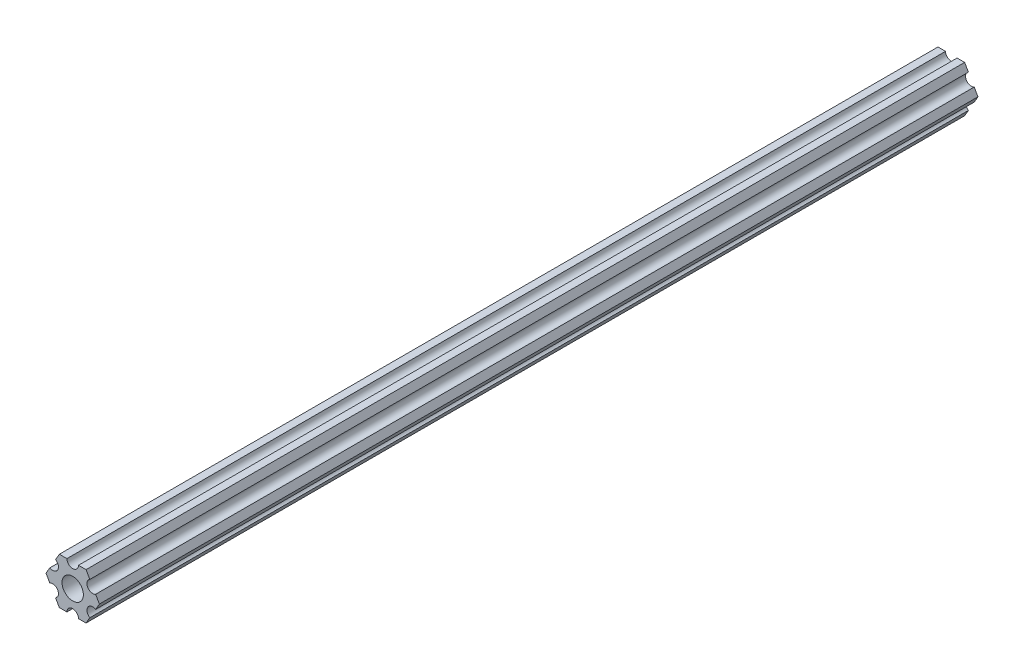
ISO-10303-21;
HEADER;
FILE_DESCRIPTION(('STEP AP214'),'2;1');
FILE_NAME('part.step','',(''),(''),'','','');
FILE_SCHEMA(('AUTOMOTIVE_DESIGN { 1 0 10303 214 1 1 1 1 }'));
ENDSEC;
DATA;
#1=APPLICATION_CONTEXT('core data for automotive mechanical design processes');
#2=APPLICATION_PROTOCOL_DEFINITION('international standard','automotive_design',2000,#1);
#3=PRODUCT_CONTEXT('',#1,'mechanical');
#4=PRODUCT('Part','Part','',(#3));
#5=PRODUCT_RELATED_PRODUCT_CATEGORY('part','',(#4));
#6=PRODUCT_DEFINITION_FORMATION('','',#4);
#7=PRODUCT_DEFINITION_CONTEXT('part definition',#1,'design');
#8=PRODUCT_DEFINITION('design','',#6,#7);
#9=PRODUCT_DEFINITION_SHAPE('','',#8);
#10=(LENGTH_UNIT() NAMED_UNIT(*) SI_UNIT(.MILLI.,.METRE.));
#11=(NAMED_UNIT(*) PLANE_ANGLE_UNIT() SI_UNIT($,.RADIAN.));
#12=(NAMED_UNIT(*) SI_UNIT($,.STERADIAN.) SOLID_ANGLE_UNIT());
#13=UNCERTAINTY_MEASURE_WITH_UNIT(LENGTH_MEASURE(1.E-05),#10,'distance_accuracy_value','');
#14=(GEOMETRIC_REPRESENTATION_CONTEXT(3) GLOBAL_UNCERTAINTY_ASSIGNED_CONTEXT((#13)) GLOBAL_UNIT_ASSIGNED_CONTEXT((#10,
#11,#12)) REPRESENTATION_CONTEXT('',''));
#15=CARTESIAN_POINT('',(0.,0.,0.));
#16=DIRECTION('',(0.,0.,1.));
#17=DIRECTION('',(1.,0.,0.));
#18=AXIS2_PLACEMENT_3D('',#15,#16,#17);
#19=CARTESIAN_POINT('',(-5.49926150638083,-3.17499966684068,-241.3));
#20=DIRECTION('',(0.,0.,1.));
#21=DIRECTION('',(1.,0.,0.));
#22=AXIS2_PLACEMENT_3D('',#19,#20,#21);
#23=CYLINDRICAL_SURFACE('',#22,1.58750000000001);
#24=CARTESIAN_POINT('',(-5.49926150638083,-3.17499966684068,0.));
#25=DIRECTION('',(0.,0.,-1.));
#26=DIRECTION('',(-1.,0.,0.));
#27=AXIS2_PLACEMENT_3D('',#24,#25,#26);
#28=CIRCLE('',#27,1.58750000000001);
#29=CARTESIAN_POINT('',(-6.29301142309098,-1.80018429024546,0.));
#30=VERTEX_POINT('',#29);
#31=CARTESIAN_POINT('',(-4.70551158967068,-4.54981504343589,0.));
#32=VERTEX_POINT('',#31);
#33=EDGE_CURVE('E190',#30,#32,#28,.T.);
#34=ORIENTED_EDGE('',*,*,#33,.F.);
#35=DIRECTION('',(0.,0.,1.));
#36=VECTOR('',#35,1.);
#37=CARTESIAN_POINT('',(-6.29301142309098,-1.80018429024546,-241.3));
#38=LINE('',#37,#36);
#39=CARTESIAN_POINT('',(-6.29301142309098,-1.80018429024546,-241.3));
#40=VERTEX_POINT('',#39);
#41=EDGE_CURVE('E11',#40,#30,#38,.T.);
#42=ORIENTED_EDGE('',*,*,#41,.F.);
#43=CARTESIAN_POINT('',(-5.49926150638083,-3.17499966684068,-241.3));
#44=DIRECTION('',(0.,0.,-1.));
#45=DIRECTION('',(-1.,0.,0.));
#46=AXIS2_PLACEMENT_3D('',#43,#44,#45);
#47=CIRCLE('',#46,1.58750000000001);
#48=CARTESIAN_POINT('',(-4.70551158967068,-4.54981504343589,-241.3));
#49=VERTEX_POINT('',#48);
#50=EDGE_CURVE('E241',#40,#49,#47,.T.);
#51=ORIENTED_EDGE('',*,*,#50,.T.);
#52=DIRECTION('',(0.,0.,1.));
#53=VECTOR('',#52,1.);
#54=CARTESIAN_POINT('',(-4.70551158967068,-4.54981504343589,-241.3));
#55=LINE('',#54,#53);
#56=EDGE_CURVE('E36',#49,#32,#55,.T.);
#57=ORIENTED_EDGE('',*,*,#56,.T.);
#58=EDGE_LOOP('',(#34,#42,#51,#57));
#59=FACE_BOUND('',#58,.T.);
#60=ADVANCED_FACE('F33',(#59),#23,.F.);
#61=CARTESIAN_POINT('',(-7.33234841870826,4.44212518856872E-07,-241.3));
#62=DIRECTION('',(-0.866025434075723,-0.499999947533953,0.));
#63=DIRECTION('',(0.499999947533953,-0.866025434075723,0.));
#64=AXIS2_PLACEMENT_3D('',#61,#62,#63);
#65=PLANE('',#64);
#66=DIRECTION('',(0.499999947533953,-0.866025434075723,0.));
#67=VECTOR('',#66,1.);
#68=CARTESIAN_POINT('',(-7.33234841870826,4.44212518856872E-07,0.));
#69=LINE('',#68,#67);
#70=CARTESIAN_POINT('',(-7.33234841870826,4.44212518856872E-07,0.));
#71=VERTEX_POINT('',#70);
#72=EDGE_CURVE('E239',#71,#30,#69,.T.);
#73=ORIENTED_EDGE('',*,*,#72,.F.);
#74=DIRECTION('',(0.,0.,1.));
#75=VECTOR('',#74,1.);
#76=CARTESIAN_POINT('',(-7.33234841870826,4.44212518856872E-07,-241.3));
#77=LINE('',#76,#75);
#78=CARTESIAN_POINT('',(-7.33234841870826,4.44212518856872E-07,-241.3));
#79=VERTEX_POINT('',#78);
#80=EDGE_CURVE('E42',#79,#71,#77,.T.);
#81=ORIENTED_EDGE('',*,*,#80,.F.);
#82=DIRECTION('',(0.499999947533953,-0.866025434075723,0.));
#83=VECTOR('',#82,1.);
#84=CARTESIAN_POINT('',(-7.33234841870826,4.44212518856872E-07,-241.3));
#85=LINE('',#84,#83);
#86=EDGE_CURVE('E180',#79,#40,#85,.T.);
#87=ORIENTED_EDGE('',*,*,#86,.T.);
#88=ORIENTED_EDGE('',*,*,#41,.T.);
#89=EDGE_LOOP('',(#73,#81,#87,#88));
#90=FACE_BOUND('',#89,.T.);
#91=ADVANCED_FACE('F273',(#90),#65,.T.);
#92=CARTESIAN_POINT('',(-6.29301120497139,1.80018505273895,-241.3));
#93=DIRECTION('',(-0.866025373493145,0.500000052466056,0.));
#94=DIRECTION('',(-0.500000052466056,-0.866025373493145,0.));
#95=AXIS2_PLACEMENT_3D('',#92,#93,#94);
#96=PLANE('',#95);
#97=DIRECTION('',(-0.500000052466056,-0.866025373493145,0.));
#98=VECTOR('',#97,1.);
#99=CARTESIAN_POINT('',(-6.29301120497139,1.80018505273895,0.));
#100=LINE('',#99,#98);
#101=CARTESIAN_POINT('',(-6.29301120497139,1.80018505273895,0.));
#102=VERTEX_POINT('',#101);
#103=EDGE_CURVE('E167',#102,#71,#100,.T.);
#104=ORIENTED_EDGE('',*,*,#103,.F.);
#105=DIRECTION('',(0.,0.,1.));
#106=VECTOR('',#105,1.);
#107=CARTESIAN_POINT('',(-6.29301120497139,1.80018505273895,-241.3));
#108=LINE('',#107,#106);
#109=CARTESIAN_POINT('',(-6.29301120497139,1.80018505273895,-241.3));
#110=VERTEX_POINT('',#109);
#111=EDGE_CURVE('E162',#110,#102,#108,.T.);
#112=ORIENTED_EDGE('',*,*,#111,.F.);
#113=DIRECTION('',(-0.500000052466056,-0.866025373493145,0.));
#114=VECTOR('',#113,1.);
#115=CARTESIAN_POINT('',(-6.29301120497139,1.80018505273895,-241.3));
#116=LINE('',#115,#114);
#117=EDGE_CURVE('E165',#110,#79,#116,.T.);
#118=ORIENTED_EDGE('',*,*,#117,.T.);
#119=ORIENTED_EDGE('',*,*,#80,.T.);
#120=EDGE_LOOP('',(#104,#112,#118,#119));
#121=FACE_BOUND('',#120,.T.);
#122=ADVANCED_FACE('F164',(#121),#96,.T.);
#123=CARTESIAN_POINT('',(-5.49926112168152,3.17500033315931,-241.3));
#124=DIRECTION('',(0.,0.,1.));
#125=DIRECTION('',(1.,0.,0.));
#126=AXIS2_PLACEMENT_3D('',#123,#124,#125);
#127=CYLINDRICAL_SURFACE('',#126,1.5875);
#128=CARTESIAN_POINT('',(-5.49926112168152,3.17500033315931,0.));
#129=DIRECTION('',(0.,0.,-1.));
#130=DIRECTION('',(-1.,0.,0.));
#131=AXIS2_PLACEMENT_3D('',#128,#129,#130);
#132=CIRCLE('',#131,1.5875);
#133=CARTESIAN_POINT('',(-4.70551103839166,4.54981561357968,0.));
#134=VERTEX_POINT('',#133);
#135=EDGE_CURVE('E236',#134,#102,#132,.T.);
#136=ORIENTED_EDGE('',*,*,#135,.F.);
#137=DIRECTION('',(0.,0.,1.));
#138=VECTOR('',#137,1.);
#139=CARTESIAN_POINT('',(-4.70551103839166,4.54981561357968,-241.3));
#140=LINE('',#139,#138);
#141=CARTESIAN_POINT('',(-4.70551103839166,4.54981561357968,-241.3));
#142=VERTEX_POINT('',#141);
#143=EDGE_CURVE('E172',#142,#134,#140,.T.);
#144=ORIENTED_EDGE('',*,*,#143,.F.);
#145=CARTESIAN_POINT('',(-5.49926112168152,3.17500033315931,-241.3));
#146=DIRECTION('',(0.,0.,-1.));
#147=DIRECTION('',(-1.,0.,0.));
#148=AXIS2_PLACEMENT_3D('',#145,#146,#147);
#149=CIRCLE('',#148,1.5875);
#150=EDGE_CURVE('E178',#142,#110,#149,.T.);
#151=ORIENTED_EDGE('',*,*,#150,.T.);
#152=ORIENTED_EDGE('',*,*,#111,.T.);
#153=EDGE_LOOP('',(#136,#144,#151,#152));
#154=FACE_BOUND('',#153,.T.);
#155=ADVANCED_FACE('F182',(#154),#127,.F.);
#156=CARTESIAN_POINT('',(-3.66617382465472,6.35000022210622,-241.3));
#157=DIRECTION('',(-0.866025373493145,0.500000052466056,0.));
#158=DIRECTION('',(-0.500000052466056,-0.866025373493145,0.));
#159=AXIS2_PLACEMENT_3D('',#156,#157,#158);
#160=PLANE('',#159);
#161=DIRECTION('',(-0.500000052466056,-0.866025373493145,0.));
#162=VECTOR('',#161,1.);
#163=CARTESIAN_POINT('',(-3.66617382465472,6.35000022210622,0.));
#164=LINE('',#163,#162);
#165=CARTESIAN_POINT('',(-3.66617382465472,6.35000022210622,0.));
#166=VERTEX_POINT('',#165);
#167=EDGE_CURVE('E233',#166,#134,#164,.T.);
#168=ORIENTED_EDGE('',*,*,#167,.F.);
#169=DIRECTION('',(0.,0.,1.));
#170=VECTOR('',#169,1.);
#171=CARTESIAN_POINT('',(-3.66617382465472,6.35000022210622,-241.3));
#172=LINE('',#171,#170);
#173=CARTESIAN_POINT('',(-3.66617382465472,6.35000022210622,-241.3));
#174=VERTEX_POINT('',#173);
#175=EDGE_CURVE('E245',#174,#166,#172,.T.);
#176=ORIENTED_EDGE('',*,*,#175,.F.);
#177=DIRECTION('',(-0.500000052466056,-0.866025373493145,0.));
#178=VECTOR('',#177,1.);
#179=CARTESIAN_POINT('',(-3.66617382465472,6.35000022210622,-241.3));
#180=LINE('',#179,#178);
#181=EDGE_CURVE('E183',#174,#142,#180,.T.);
#182=ORIENTED_EDGE('',*,*,#181,.T.);
#183=ORIENTED_EDGE('',*,*,#143,.T.);
#184=EDGE_LOOP('',(#168,#176,#182,#183));
#185=FACE_BOUND('',#184,.T.);
#186=ADVANCED_FACE('F286',(#185),#160,.T.);
#187=CARTESIAN_POINT('',(-1.58749884590197,6.35000022210623,-241.3));
#188=DIRECTION('',(0.,1.,0.));
#189=DIRECTION('',(-1.,0.,0.));
#190=AXIS2_PLACEMENT_3D('',#187,#188,#189);
#191=PLANE('',#190);
#192=DIRECTION('',(-1.,0.,0.));
#193=VECTOR('',#192,1.);
#194=CARTESIAN_POINT('',(-1.58749884590197,6.35000022210623,0.));
#195=LINE('',#194,#193);
#196=CARTESIAN_POINT('',(-1.58749884590197,6.35000022210623,0.));
#197=VERTEX_POINT('',#196);
#198=EDGE_CURVE('E230',#197,#166,#195,.T.);
#199=ORIENTED_EDGE('',*,*,#198,.F.);
#200=DIRECTION('',(0.,0.,1.));
#201=VECTOR('',#200,1.);
#202=CARTESIAN_POINT('',(-1.58749884590197,6.35000022210623,-241.3));
#203=LINE('',#202,#201);
#204=CARTESIAN_POINT('',(-1.58749884590197,6.35000022210623,-241.3));
#205=VERTEX_POINT('',#204);
#206=EDGE_CURVE('E247',#205,#197,#203,.T.);
#207=ORIENTED_EDGE('',*,*,#206,.F.);
#208=DIRECTION('',(-1.,0.,0.));
#209=VECTOR('',#208,1.);
#210=CARTESIAN_POINT('',(-1.58749884590197,6.35000022210623,-241.3));
#211=LINE('',#210,#209);
#212=EDGE_CURVE('E185',#205,#174,#211,.T.);
#213=ORIENTED_EDGE('',*,*,#212,.T.);
#214=ORIENTED_EDGE('',*,*,#175,.T.);
#215=EDGE_LOOP('',(#199,#207,#213,#214));
#216=FACE_BOUND('',#215,.T.);
#217=ADVANCED_FACE('F289',(#216),#191,.T.);
#218=CARTESIAN_POINT('',(3.84699344941095E-07,6.35000022210623,-241.3));
#219=DIRECTION('',(0.,0.,1.));
#220=DIRECTION('',(1.,0.,0.));
#221=AXIS2_PLACEMENT_3D('',#218,#219,#220);
#222=CYLINDRICAL_SURFACE('',#221,1.58749884590197);
#223=CARTESIAN_POINT('',(3.84699344941095E-07,6.35000022210623,0.));
#224=DIRECTION('',(0.,0.,-1.));
#225=DIRECTION('',(-1.,0.,0.));
#226=AXIS2_PLACEMENT_3D('',#223,#224,#225);
#227=CIRCLE('',#226,1.58749884590197);
#228=CARTESIAN_POINT('',(1.58749923060131,6.35000022210623,0.));
#229=VERTEX_POINT('',#228);
#230=EDGE_CURVE('E227',#229,#197,#227,.T.);
#231=ORIENTED_EDGE('',*,*,#230,.F.);
#232=DIRECTION('',(0.,0.,1.));
#233=VECTOR('',#232,1.);
#234=CARTESIAN_POINT('',(1.58749923060131,6.35000022210623,-241.3));
#235=LINE('',#234,#233);
#236=CARTESIAN_POINT('',(1.58749923060131,6.35000022210623,-241.3));
#237=VERTEX_POINT('',#236);
#238=EDGE_CURVE('E249',#237,#229,#235,.T.);
#239=ORIENTED_EDGE('',*,*,#238,.F.);
#240=CARTESIAN_POINT('',(3.84699344941095E-07,6.35000022210623,-241.3));
#241=DIRECTION('',(0.,0.,-1.));
#242=DIRECTION('',(-1.,0.,0.));
#243=AXIS2_PLACEMENT_3D('',#240,#241,#242);
#244=CIRCLE('',#243,1.58749884590197);
#245=EDGE_CURVE('E394',#237,#205,#244,.T.);
#246=ORIENTED_EDGE('',*,*,#245,.T.);
#247=ORIENTED_EDGE('',*,*,#206,.T.);
#248=EDGE_LOOP('',(#231,#239,#246,#247));
#249=FACE_BOUND('',#248,.T.);
#250=ADVANCED_FACE('F293',(#249),#222,.F.);
#251=CARTESIAN_POINT('',(3.66617452134701,6.35000022210623,-241.3));
#252=DIRECTION('',(0.,1.,0.));
#253=DIRECTION('',(-1.,0.,0.));
#254=AXIS2_PLACEMENT_3D('',#251,#252,#253);
#255=PLANE('',#254);
#256=DIRECTION('',(-1.,0.,0.));
#257=VECTOR('',#256,1.);
#258=CARTESIAN_POINT('',(3.66617452134701,6.35000022210623,0.));
#259=LINE('',#258,#257);
#260=CARTESIAN_POINT('',(3.66617452134701,6.35000022210623,0.));
#261=VERTEX_POINT('',#260);
#262=EDGE_CURVE('E224',#261,#229,#259,.T.);
#263=ORIENTED_EDGE('',*,*,#262,.F.);
#264=DIRECTION('',(0.,0.,1.));
#265=VECTOR('',#264,1.);
#266=CARTESIAN_POINT('',(3.66617452134701,6.35000022210623,-241.3));
#267=LINE('',#266,#265);
#268=CARTESIAN_POINT('',(3.66617452134701,6.35000022210623,-241.3));
#269=VERTEX_POINT('',#268);
#270=EDGE_CURVE('E251',#269,#261,#267,.T.);
#271=ORIENTED_EDGE('',*,*,#270,.F.);
#272=DIRECTION('',(-1.,0.,0.));
#273=VECTOR('',#272,1.);
#274=CARTESIAN_POINT('',(3.66617452134701,6.35000022210623,-241.3));
#275=LINE('',#274,#273);
#276=EDGE_CURVE('E391',#269,#237,#275,.T.);
#277=ORIENTED_EDGE('',*,*,#276,.T.);
#278=ORIENTED_EDGE('',*,*,#238,.T.);
#279=EDGE_LOOP('',(#263,#271,#277,#278));
#280=FACE_BOUND('',#279,.T.);
#281=ADVANCED_FACE('F297',(#280),#255,.T.);
#282=CARTESIAN_POINT('',(4.70551142760333,4.54981551649452,-241.3));
#283=DIRECTION('',(0.866025449221368,0.499999921300922,0.));
#284=DIRECTION('',(-0.499999921300922,0.866025449221368,0.));
#285=AXIS2_PLACEMENT_3D('',#282,#283,#284);
#286=PLANE('',#285);
#287=DIRECTION('',(-0.499999921300922,0.866025449221368,0.));
#288=VECTOR('',#287,1.);
#289=CARTESIAN_POINT('',(4.70551142760333,4.54981551649452,0.));
#290=LINE('',#289,#288);
#291=CARTESIAN_POINT('',(4.70551142760333,4.54981551649452,0.));
#292=VERTEX_POINT('',#291);
#293=EDGE_CURVE('E221',#292,#261,#290,.T.);
#294=ORIENTED_EDGE('',*,*,#293,.F.);
#295=DIRECTION('',(0.,0.,1.));
#296=VECTOR('',#295,1.);
#297=CARTESIAN_POINT('',(4.70551142760333,4.54981551649452,-241.3));
#298=LINE('',#297,#296);
#299=CARTESIAN_POINT('',(4.70551142760333,4.54981551649452,-241.3));
#300=VERTEX_POINT('',#299);
#301=EDGE_CURVE('E253',#300,#292,#298,.T.);
#302=ORIENTED_EDGE('',*,*,#301,.F.);
#303=DIRECTION('',(-0.499999921300922,0.866025449221368,0.));
#304=VECTOR('',#303,1.);
#305=CARTESIAN_POINT('',(4.70551142760333,4.54981551649452,-241.3));
#306=LINE('',#305,#304);
#307=EDGE_CURVE('E388',#300,#269,#306,.T.);
#308=ORIENTED_EDGE('',*,*,#307,.T.);
#309=ORIENTED_EDGE('',*,*,#270,.T.);
#310=EDGE_LOOP('',(#294,#302,#308,#309));
#311=FACE_BOUND('',#310,.T.);
#312=ADVANCED_FACE('F301',(#311),#286,.T.);
#313=CARTESIAN_POINT('',(5.49926130266854,3.1750001158556,-241.3));
#314=DIRECTION('',(0.,0.,1.));
#315=DIRECTION('',(1.,0.,0.));
#316=AXIS2_PLACEMENT_3D('',#313,#314,#315);
#317=CYLINDRICAL_SURFACE('',#316,1.5875);
#318=CARTESIAN_POINT('',(5.49926130266854,3.1750001158556,0.));
#319=DIRECTION('',(0.,0.,-1.));
#320=DIRECTION('',(-1.,0.,0.));
#321=AXIS2_PLACEMENT_3D('',#318,#319,#320);
#322=CIRCLE('',#321,1.5875);
#323=CARTESIAN_POINT('',(6.29301117773375,1.80018471521667,0.));
#324=VERTEX_POINT('',#323);
#325=EDGE_CURVE('E218',#324,#292,#322,.T.);
#326=ORIENTED_EDGE('',*,*,#325,.F.);
#327=DIRECTION('',(0.,0.,1.));
#328=VECTOR('',#327,1.);
#329=CARTESIAN_POINT('',(6.29301117773375,1.80018471521667,-241.3));
#330=LINE('',#329,#328);
#331=CARTESIAN_POINT('',(6.29301117773375,1.80018471521667,-241.3));
#332=VERTEX_POINT('',#331);
#333=EDGE_CURVE('E255',#332,#324,#330,.T.);
#334=ORIENTED_EDGE('',*,*,#333,.F.);
#335=CARTESIAN_POINT('',(5.49926130266854,3.1750001158556,-241.3));
#336=DIRECTION('',(0.,0.,-1.));
#337=DIRECTION('',(-1.,0.,0.));
#338=AXIS2_PLACEMENT_3D('',#335,#336,#337);
#339=CIRCLE('',#338,1.5875);
#340=EDGE_CURVE('E385',#332,#300,#339,.T.);
#341=ORIENTED_EDGE('',*,*,#340,.T.);
#342=ORIENTED_EDGE('',*,*,#301,.T.);
#343=EDGE_LOOP('',(#326,#334,#341,#342));
#344=FACE_BOUND('',#343,.T.);
#345=ADVANCED_FACE('F305',(#344),#317,.F.);
#346=CARTESIAN_POINT('',(7.33234803400895,9.61748368946088E-08,-241.3));
#347=DIRECTION('',(0.866025449221368,0.499999921300922,0.));
#348=DIRECTION('',(-0.499999921300922,0.866025449221368,0.));
#349=AXIS2_PLACEMENT_3D('',#346,#347,#348);
#350=PLANE('',#349);
#351=DIRECTION('',(-0.499999921300922,0.866025449221368,0.));
#352=VECTOR('',#351,1.);
#353=CARTESIAN_POINT('',(7.33234803400895,9.61748368946088E-08,0.));
#354=LINE('',#353,#352);
#355=CARTESIAN_POINT('',(7.33234803400895,9.61748368946088E-08,0.));
#356=VERTEX_POINT('',#355);
#357=EDGE_CURVE('E215',#356,#324,#354,.T.);
#358=ORIENTED_EDGE('',*,*,#357,.F.);
#359=DIRECTION('',(0.,0.,1.));
#360=VECTOR('',#359,1.);
#361=CARTESIAN_POINT('',(7.33234803400895,9.61748368946088E-08,-241.3));
#362=LINE('',#361,#360);
#363=CARTESIAN_POINT('',(7.33234803400895,9.61748368946088E-08,-241.3));
#364=VERTEX_POINT('',#363);
#365=EDGE_CURVE('E257',#364,#356,#362,.T.);
#366=ORIENTED_EDGE('',*,*,#365,.F.);
#367=DIRECTION('',(-0.499999921300922,0.866025449221368,0.));
#368=VECTOR('',#367,1.);
#369=CARTESIAN_POINT('',(7.33234803400895,9.61748368946088E-08,-241.3));
#370=LINE('',#369,#368);
#371=EDGE_CURVE('E382',#364,#332,#370,.T.);
#372=ORIENTED_EDGE('',*,*,#371,.T.);
#373=ORIENTED_EDGE('',*,*,#333,.T.);
#374=EDGE_LOOP('',(#358,#366,#372,#373));
#375=FACE_BOUND('',#374,.T.);
#376=ADVANCED_FACE('F309',(#375),#350,.T.);
#377=CARTESIAN_POINT('',(6.29301092933191,-1.80018457531732,-241.3));
#378=DIRECTION('',(0.866025403784438,-0.5,0.));
#379=DIRECTION('',(0.5,0.866025403784438,0.));
#380=AXIS2_PLACEMENT_3D('',#377,#378,#379);
#381=PLANE('',#380);
#382=DIRECTION('',(0.5,0.866025403784438,0.));
#383=VECTOR('',#382,1.);
#384=CARTESIAN_POINT('',(6.29301092933191,-1.80018457531732,0.));
#385=LINE('',#384,#383);
#386=CARTESIAN_POINT('',(6.29301092933191,-1.80018457531732,0.));
#387=VERTEX_POINT('',#386);
#388=EDGE_CURVE('E212',#387,#356,#385,.T.);
#389=ORIENTED_EDGE('',*,*,#388,.F.);
#390=DIRECTION('',(0.,0.,1.));
#391=VECTOR('',#390,1.);
#392=CARTESIAN_POINT('',(6.29301092933191,-1.80018457531732,-241.3));
#393=LINE('',#392,#391);
#394=CARTESIAN_POINT('',(6.29301092933191,-1.80018457531732,-241.3));
#395=VERTEX_POINT('',#394);
#396=EDGE_CURVE('E259',#395,#387,#393,.T.);
#397=ORIENTED_EDGE('',*,*,#396,.F.);
#398=DIRECTION('',(0.5,0.866025403784438,0.));
#399=VECTOR('',#398,1.);
#400=CARTESIAN_POINT('',(6.29301092933191,-1.80018457531732,-241.3));
#401=LINE('',#400,#399);
#402=EDGE_CURVE('E379',#395,#364,#401,.T.);
#403=ORIENTED_EDGE('',*,*,#402,.T.);
#404=ORIENTED_EDGE('',*,*,#365,.T.);
#405=EDGE_LOOP('',(#389,#397,#403,#404));
#406=FACE_BOUND('',#405,.T.);
#407=ADVANCED_FACE('F313',(#406),#381,.T.);
#408=CARTESIAN_POINT('',(5.49926092933191,-3.17499990382512,-241.3));
#409=DIRECTION('',(0.,0.,1.));
#410=DIRECTION('',(1.,0.,0.));
#411=AXIS2_PLACEMENT_3D('',#408,#409,#410);
#412=CYLINDRICAL_SURFACE('',#411,1.5875);
#413=CARTESIAN_POINT('',(5.49926092933191,-3.17499990382512,0.));
#414=DIRECTION('',(0.,0.,-1.));
#415=DIRECTION('',(-1.,0.,0.));
#416=AXIS2_PLACEMENT_3D('',#413,#414,#415);
#417=CIRCLE('',#416,1.5875);
#418=CARTESIAN_POINT('',(4.70551092933191,-4.54981523233291,0.));
#419=VERTEX_POINT('',#418);
#420=EDGE_CURVE('E209',#419,#387,#417,.T.);
#421=ORIENTED_EDGE('',*,*,#420,.F.);
#422=DIRECTION('',(0.,0.,1.));
#423=VECTOR('',#422,1.);
#424=CARTESIAN_POINT('',(4.70551092933191,-4.54981523233291,-241.3));
#425=LINE('',#424,#423);
#426=CARTESIAN_POINT('',(4.70551092933191,-4.54981523233291,-241.3));
#427=VERTEX_POINT('',#426);
#428=EDGE_CURVE('E261',#427,#419,#425,.T.);
#429=ORIENTED_EDGE('',*,*,#428,.F.);
#430=CARTESIAN_POINT('',(5.49926092933191,-3.17499990382512,-241.3));
#431=DIRECTION('',(0.,0.,-1.));
#432=DIRECTION('',(-1.,0.,0.));
#433=AXIS2_PLACEMENT_3D('',#430,#431,#432);
#434=CIRCLE('',#433,1.5875);
#435=EDGE_CURVE('E376',#427,#395,#434,.T.);
#436=ORIENTED_EDGE('',*,*,#435,.T.);
#437=ORIENTED_EDGE('',*,*,#396,.T.);
#438=EDGE_LOOP('',(#421,#429,#436,#437));
#439=FACE_BOUND('',#438,.T.);
#440=ADVANCED_FACE('F317',(#439),#412,.F.);
#441=CARTESIAN_POINT('',(3.66617382465481,-6.34999990382519,-241.3));
#442=DIRECTION('',(0.866025403784439,-0.5,0.));
#443=DIRECTION('',(0.5,0.866025403784439,0.));
#444=AXIS2_PLACEMENT_3D('',#441,#442,#443);
#445=PLANE('',#444);
#446=DIRECTION('',(0.5,0.866025403784439,0.));
#447=VECTOR('',#446,1.);
#448=CARTESIAN_POINT('',(3.66617382465481,-6.34999990382519,0.));
#449=LINE('',#448,#447);
#450=CARTESIAN_POINT('',(3.66617382465481,-6.34999990382519,0.));
#451=VERTEX_POINT('',#450);
#452=EDGE_CURVE('E206',#451,#419,#449,.T.);
#453=ORIENTED_EDGE('',*,*,#452,.F.);
#454=DIRECTION('',(0.,0.,1.));
#455=VECTOR('',#454,1.);
#456=CARTESIAN_POINT('',(3.66617382465481,-6.34999990382519,-241.3));
#457=LINE('',#456,#455);
#458=CARTESIAN_POINT('',(3.66617382465481,-6.34999990382519,-241.3));
#459=VERTEX_POINT('',#458);
#460=EDGE_CURVE('E263',#459,#451,#457,.T.);
#461=ORIENTED_EDGE('',*,*,#460,.F.);
#462=DIRECTION('',(0.5,0.866025403784439,0.));
#463=VECTOR('',#462,1.);
#464=CARTESIAN_POINT('',(3.66617382465481,-6.34999990382519,-241.3));
#465=LINE('',#464,#463);
#466=EDGE_CURVE('E373',#459,#427,#465,.T.);
#467=ORIENTED_EDGE('',*,*,#466,.T.);
#468=ORIENTED_EDGE('',*,*,#428,.T.);
#469=EDGE_LOOP('',(#453,#461,#467,#468));
#470=FACE_BOUND('',#469,.T.);
#471=ADVANCED_FACE('F321',(#470),#445,.T.);
#472=CARTESIAN_POINT('',(1.58750115409778,-6.34999990382519,-241.3));
#473=DIRECTION('',(0.,-1.,0.));
#474=DIRECTION('',(1.,0.,0.));
#475=AXIS2_PLACEMENT_3D('',#472,#473,#474);
#476=PLANE('',#475);
#477=DIRECTION('',(1.,0.,0.));
#478=VECTOR('',#477,1.);
#479=CARTESIAN_POINT('',(1.58750115409778,-6.34999990382519,0.));
#480=LINE('',#479,#478);
#481=CARTESIAN_POINT('',(1.58750115409778,-6.34999990382519,0.));
#482=VERTEX_POINT('',#481);
#483=EDGE_CURVE('E203',#482,#451,#480,.T.);
#484=ORIENTED_EDGE('',*,*,#483,.F.);
#485=DIRECTION('',(0.,0.,1.));
#486=VECTOR('',#485,1.);
#487=CARTESIAN_POINT('',(1.58750115409778,-6.34999990382519,-241.3));
#488=LINE('',#487,#486);
#489=CARTESIAN_POINT('',(1.58750115409778,-6.34999990382519,-241.3));
#490=VERTEX_POINT('',#489);
#491=EDGE_CURVE('E265',#490,#482,#488,.T.);
#492=ORIENTED_EDGE('',*,*,#491,.F.);
#493=DIRECTION('',(1.,0.,0.));
#494=VECTOR('',#493,1.);
#495=CARTESIAN_POINT('',(1.58750115409778,-6.34999990382519,-241.3));
#496=LINE('',#495,#494);
#497=EDGE_CURVE('E370',#490,#459,#496,.T.);
#498=ORIENTED_EDGE('',*,*,#497,.T.);
#499=ORIENTED_EDGE('',*,*,#460,.T.);
#500=EDGE_LOOP('',(#484,#492,#498,#499));
#501=FACE_BOUND('',#500,.T.);
#502=ADVANCED_FACE('F325',(#501),#476,.T.);
#503=CARTESIAN_POINT('',(-3.8469926204343E-07,-6.34999990382519,-241.3));
#504=DIRECTION('',(0.,0.,1.));
#505=DIRECTION('',(1.,0.,0.));
#506=AXIS2_PLACEMENT_3D('',#503,#504,#505);
#507=CYLINDRICAL_SURFACE('',#506,1.58750115409778);
#508=CARTESIAN_POINT('',(-3.8469926204343E-07,-6.34999990382519,0.));
#509=DIRECTION('',(0.,0.,-1.));
#510=DIRECTION('',(-1.,0.,0.));
#511=AXIS2_PLACEMENT_3D('',#508,#509,#510);
#512=CIRCLE('',#511,1.58750115409778);
#513=CARTESIAN_POINT('',(-1.58750153879705,-6.34999990382519,0.));
#514=VERTEX_POINT('',#513);
#515=EDGE_CURVE('E200',#514,#482,#512,.T.);
#516=ORIENTED_EDGE('',*,*,#515,.F.);
#517=DIRECTION('',(0.,0.,1.));
#518=VECTOR('',#517,1.);
#519=CARTESIAN_POINT('',(-1.58750153879705,-6.34999990382519,-241.3));
#520=LINE('',#519,#518);
#521=CARTESIAN_POINT('',(-1.58750153879705,-6.34999990382519,-241.3));
#522=VERTEX_POINT('',#521);
#523=EDGE_CURVE('E267',#522,#514,#520,.T.);
#524=ORIENTED_EDGE('',*,*,#523,.F.);
#525=CARTESIAN_POINT('',(-3.8469926204343E-07,-6.34999990382519,-241.3));
#526=DIRECTION('',(0.,0.,-1.));
#527=DIRECTION('',(-1.,0.,0.));
#528=AXIS2_PLACEMENT_3D('',#525,#526,#527);
#529=CIRCLE('',#528,1.58750115409778);
#530=EDGE_CURVE('E367',#522,#490,#529,.T.);
#531=ORIENTED_EDGE('',*,*,#530,.T.);
#532=ORIENTED_EDGE('',*,*,#491,.T.);
#533=EDGE_LOOP('',(#516,#524,#531,#532));
#534=FACE_BOUND('',#533,.T.);
#535=ADVANCED_FACE('F329',(#534),#507,.F.);
#536=CARTESIAN_POINT('',(-3.66617452134693,-6.34999990382519,-241.3));
#537=DIRECTION('',(0.,-1.,0.));
#538=DIRECTION('',(1.,0.,0.));
#539=AXIS2_PLACEMENT_3D('',#536,#537,#538);
#540=PLANE('',#539);
#541=DIRECTION('',(1.,0.,0.));
#542=VECTOR('',#541,1.);
#543=CARTESIAN_POINT('',(-3.66617452134693,-6.34999990382519,0.));
#544=LINE('',#543,#542);
#545=CARTESIAN_POINT('',(-3.66617452134693,-6.34999990382519,0.));
#546=VERTEX_POINT('',#545);
#547=EDGE_CURVE('E197',#546,#514,#544,.T.);
#548=ORIENTED_EDGE('',*,*,#547,.F.);
#549=DIRECTION('',(0.,0.,1.));
#550=VECTOR('',#549,1.);
#551=CARTESIAN_POINT('',(-3.66617452134693,-6.34999990382519,-241.3));
#552=LINE('',#551,#550);
#553=CARTESIAN_POINT('',(-3.66617452134693,-6.34999990382519,-241.3));
#554=VERTEX_POINT('',#553);
#555=EDGE_CURVE('E268',#554,#546,#552,.T.);
#556=ORIENTED_EDGE('',*,*,#555,.F.);
#557=DIRECTION('',(1.,0.,0.));
#558=VECTOR('',#557,1.);
#559=CARTESIAN_POINT('',(-3.66617452134693,-6.34999990382519,-241.3));
#560=LINE('',#559,#558);
#561=EDGE_CURVE('E364',#554,#522,#560,.T.);
#562=ORIENTED_EDGE('',*,*,#561,.T.);
#563=ORIENTED_EDGE('',*,*,#523,.T.);
#564=EDGE_LOOP('',(#548,#556,#562,#563));
#565=FACE_BOUND('',#564,.T.);
#566=ADVANCED_FACE('F333',(#565),#540,.T.);
#567=CARTESIAN_POINT('',(-4.70551158967068,-4.54981504343589,-241.3));
#568=DIRECTION('',(-0.866025434075723,-0.499999947533953,0.));
#569=DIRECTION('',(0.499999947533953,-0.866025434075723,0.));
#570=AXIS2_PLACEMENT_3D('',#567,#568,#569);
#571=PLANE('',#570);
#572=DIRECTION('',(0.499999947533953,-0.866025434075723,0.));
#573=VECTOR('',#572,1.);
#574=CARTESIAN_POINT('',(-4.70551158967068,-4.54981504343589,0.));
#575=LINE('',#574,#573);
#576=EDGE_CURVE('E193',#32,#546,#575,.T.);
#577=ORIENTED_EDGE('',*,*,#576,.F.);
#578=ORIENTED_EDGE('',*,*,#56,.F.);
#579=DIRECTION('',(0.499999947533953,-0.866025434075723,0.));
#580=VECTOR('',#579,1.);
#581=CARTESIAN_POINT('',(-4.70551158967068,-4.54981504343589,-241.3));
#582=LINE('',#581,#580);
#583=EDGE_CURVE('E362',#49,#554,#582,.T.);
#584=ORIENTED_EDGE('',*,*,#583,.T.);
#585=ORIENTED_EDGE('',*,*,#555,.T.);
#586=EDGE_LOOP('',(#577,#578,#584,#585));
#587=FACE_BOUND('',#586,.T.);
#588=ADVANCED_FACE('F270',(#587),#571,.T.);
#589=CARTESIAN_POINT('',(-5.49926150638083,-3.17499966684068,-241.3));
#590=DIRECTION('',(0.,0.,-1.));
#591=DIRECTION('',(-1.,0.,0.));
#592=AXIS2_PLACEMENT_3D('',#589,#590,#591);
#593=PLANE('',#592);
#594=CARTESIAN_POINT('',(0.,0.,-241.3));
#595=DIRECTION('',(0.,0.,1.));
#596=DIRECTION('',(-1.,0.,0.));
#597=AXIS2_PLACEMENT_3D('',#594,#595,#596);
#598=CIRCLE('',#597,2.9337);
#599=CARTESIAN_POINT('',(2.9337,0.,-241.3));
#600=VERTEX_POINT('',#599);
#601=EDGE_CURVE('E194',#600,#600,#598,.T.);
#602=ORIENTED_EDGE('',*,*,#601,.T.);
#603=EDGE_LOOP('',(#602));
#604=FACE_BOUND('',#603,.T.);
#605=ORIENTED_EDGE('',*,*,#50,.F.);
#606=ORIENTED_EDGE('',*,*,#86,.F.);
#607=ORIENTED_EDGE('',*,*,#117,.F.);
#608=ORIENTED_EDGE('',*,*,#150,.F.);
#609=ORIENTED_EDGE('',*,*,#181,.F.);
#610=ORIENTED_EDGE('',*,*,#212,.F.);
#611=ORIENTED_EDGE('',*,*,#245,.F.);
#612=ORIENTED_EDGE('',*,*,#276,.F.);
#613=ORIENTED_EDGE('',*,*,#307,.F.);
#614=ORIENTED_EDGE('',*,*,#340,.F.);
#615=ORIENTED_EDGE('',*,*,#371,.F.);
#616=ORIENTED_EDGE('',*,*,#402,.F.);
#617=ORIENTED_EDGE('',*,*,#435,.F.);
#618=ORIENTED_EDGE('',*,*,#466,.F.);
#619=ORIENTED_EDGE('',*,*,#497,.F.);
#620=ORIENTED_EDGE('',*,*,#530,.F.);
#621=ORIENTED_EDGE('',*,*,#561,.F.);
#622=ORIENTED_EDGE('',*,*,#583,.F.);
#623=EDGE_LOOP('',(#605,#606,#607,#608,#609,#610,#611,#612,#613,#614,#615,#616,#617,#618,#619,
#620,#621,#622));
#624=FACE_BOUND('',#623,.T.);
#625=ADVANCED_FACE('F176',(#604,#624),#593,.T.);
#626=CARTESIAN_POINT('',(-5.49926150638083,-3.17499966684068,0.));
#627=DIRECTION('',(0.,0.,-1.));
#628=DIRECTION('',(-1.,0.,0.));
#629=AXIS2_PLACEMENT_3D('',#626,#627,#628);
#630=PLANE('',#629);
#631=CARTESIAN_POINT('',(0.,0.,0.));
#632=DIRECTION('',(0.,0.,1.));
#633=DIRECTION('',(-1.,0.,0.));
#634=AXIS2_PLACEMENT_3D('',#631,#632,#633);
#635=CIRCLE('',#634,2.9337);
#636=CARTESIAN_POINT('',(2.9337,0.,0.));
#637=VERTEX_POINT('',#636);
#638=EDGE_CURVE('E357',#637,#637,#635,.T.);
#639=ORIENTED_EDGE('',*,*,#638,.F.);
#640=EDGE_LOOP('',(#639));
#641=FACE_BOUND('',#640,.T.);
#642=ORIENTED_EDGE('',*,*,#33,.T.);
#643=ORIENTED_EDGE('',*,*,#576,.T.);
#644=ORIENTED_EDGE('',*,*,#547,.T.);
#645=ORIENTED_EDGE('',*,*,#515,.T.);
#646=ORIENTED_EDGE('',*,*,#483,.T.);
#647=ORIENTED_EDGE('',*,*,#452,.T.);
#648=ORIENTED_EDGE('',*,*,#420,.T.);
#649=ORIENTED_EDGE('',*,*,#388,.T.);
#650=ORIENTED_EDGE('',*,*,#357,.T.);
#651=ORIENTED_EDGE('',*,*,#325,.T.);
#652=ORIENTED_EDGE('',*,*,#293,.T.);
#653=ORIENTED_EDGE('',*,*,#262,.T.);
#654=ORIENTED_EDGE('',*,*,#230,.T.);
#655=ORIENTED_EDGE('',*,*,#198,.T.);
#656=ORIENTED_EDGE('',*,*,#167,.T.);
#657=ORIENTED_EDGE('',*,*,#135,.T.);
#658=ORIENTED_EDGE('',*,*,#103,.T.);
#659=ORIENTED_EDGE('',*,*,#72,.T.);
#660=EDGE_LOOP('',(#642,#643,#644,#645,#646,#647,#648,#649,#650,#651,#652,#653,#654,#655,#656,
#657,#658,#659));
#661=FACE_BOUND('',#660,.T.);
#662=ADVANCED_FACE('F272',(#641,#661),#630,.F.);
#663=CARTESIAN_POINT('',(0.,0.,-241.3));
#664=DIRECTION('',(0.,0.,1.));
#665=DIRECTION('',(1.,0.,0.));
#666=AXIS2_PLACEMENT_3D('',#663,#664,#665);
#667=CYLINDRICAL_SURFACE('',#666,2.9337);
#668=CARTESIAN_POINT('',(2.9337,0.,-241.3));
#669=CARTESIAN_POINT('',(2.9337,0.,-238.786458333333));
#670=CARTESIAN_POINT('',(2.9337,0.,-236.272916666667));
#671=CARTESIAN_POINT('',(2.9337,0.,-231.245833333333));
#672=CARTESIAN_POINT('',(2.9337,0.,-228.732291666667));
#673=CARTESIAN_POINT('',(2.9337,0.,-223.705208333333));
#674=CARTESIAN_POINT('',(2.9337,0.,-221.191666666667));
#675=CARTESIAN_POINT('',(2.9337,0.,-216.164583333333));
#676=CARTESIAN_POINT('',(2.9337,0.,-213.651041666667));
#677=CARTESIAN_POINT('',(2.9337,0.,-208.623958333333));
#678=CARTESIAN_POINT('',(2.9337,0.,-206.110416666667));
#679=CARTESIAN_POINT('',(2.9337,0.,-201.083333333333));
#680=CARTESIAN_POINT('',(2.9337,0.,-198.569791666667));
#681=CARTESIAN_POINT('',(2.9337,0.,-193.542708333333));
#682=CARTESIAN_POINT('',(2.9337,0.,-191.029166666667));
#683=CARTESIAN_POINT('',(2.9337,0.,-186.002083333333));
#684=CARTESIAN_POINT('',(2.9337,0.,-183.488541666667));
#685=CARTESIAN_POINT('',(2.9337,0.,-178.461458333333));
#686=CARTESIAN_POINT('',(2.9337,0.,-175.947916666667));
#687=CARTESIAN_POINT('',(2.9337,0.,-170.920833333333));
#688=CARTESIAN_POINT('',(2.9337,0.,-168.407291666667));
#689=CARTESIAN_POINT('',(2.9337,0.,-163.380208333333));
#690=CARTESIAN_POINT('',(2.9337,0.,-160.866666666667));
#691=CARTESIAN_POINT('',(2.9337,0.,-155.839583333333));
#692=CARTESIAN_POINT('',(2.9337,0.,-153.326041666667));
#693=CARTESIAN_POINT('',(2.9337,0.,-148.298958333333));
#694=CARTESIAN_POINT('',(2.9337,0.,-145.785416666667));
#695=CARTESIAN_POINT('',(2.9337,0.,-140.758333333333));
#696=CARTESIAN_POINT('',(2.9337,0.,-138.244791666667));
#697=CARTESIAN_POINT('',(2.9337,0.,-133.217708333333));
#698=CARTESIAN_POINT('',(2.9337,0.,-130.704166666667));
#699=CARTESIAN_POINT('',(2.9337,0.,-125.677083333333));
#700=CARTESIAN_POINT('',(2.9337,0.,-123.163541666667));
#701=CARTESIAN_POINT('',(2.9337,0.,-118.136458333333));
#702=CARTESIAN_POINT('',(2.9337,0.,-115.622916666667));
#703=CARTESIAN_POINT('',(2.9337,0.,-110.595833333333));
#704=CARTESIAN_POINT('',(2.9337,0.,-108.082291666667));
#705=CARTESIAN_POINT('',(2.9337,0.,-103.055208333333));
#706=CARTESIAN_POINT('',(2.9337,0.,-100.541666666667));
#707=CARTESIAN_POINT('',(2.9337,0.,-95.5145833333333));
#708=CARTESIAN_POINT('',(2.9337,0.,-93.0010416666667));
#709=CARTESIAN_POINT('',(2.9337,0.,-87.9739583333333));
#710=CARTESIAN_POINT('',(2.9337,0.,-85.4604166666667));
#711=CARTESIAN_POINT('',(2.9337,0.,-80.4333333333333));
#712=CARTESIAN_POINT('',(2.9337,0.,-77.9197916666667));
#713=CARTESIAN_POINT('',(2.9337,0.,-72.8927083333333));
#714=CARTESIAN_POINT('',(2.9337,0.,-70.3791666666667));
#715=CARTESIAN_POINT('',(2.9337,0.,-65.3520833333334));
#716=CARTESIAN_POINT('',(2.9337,0.,-62.8385416666667));
#717=CARTESIAN_POINT('',(2.9337,0.,-57.8114583333333));
#718=CARTESIAN_POINT('',(2.9337,0.,-55.2979166666667));
#719=CARTESIAN_POINT('',(2.9337,0.,-50.2708333333333));
#720=CARTESIAN_POINT('',(2.9337,0.,-47.7572916666667));
#721=CARTESIAN_POINT('',(2.9337,0.,-42.7302083333333));
#722=CARTESIAN_POINT('',(2.9337,0.,-40.2166666666667));
#723=CARTESIAN_POINT('',(2.9337,0.,-35.1895833333333));
#724=CARTESIAN_POINT('',(2.9337,0.,-32.6760416666667));
#725=CARTESIAN_POINT('',(2.9337,0.,-27.6489583333333));
#726=CARTESIAN_POINT('',(2.9337,0.,-25.1354166666667));
#727=CARTESIAN_POINT('',(2.9337,0.,-20.1083333333333));
#728=CARTESIAN_POINT('',(2.9337,0.,-17.5947916666667));
#729=CARTESIAN_POINT('',(2.9337,0.,-12.5677083333333));
#730=CARTESIAN_POINT('',(2.9337,0.,-10.0541666666667));
#731=CARTESIAN_POINT('',(2.9337,0.,-5.02708333333333));
#732=CARTESIAN_POINT('',(2.9337,0.,-2.51354166666666));
#733=CARTESIAN_POINT('',(2.9337,0.,0.));
#734=B_SPLINE_CURVE_WITH_KNOTS('',3,(#668,#669,#670,#671,#672,#673,#674,#675,#676,#677,#678,
#679,#680,#681,#682,#683,#684,#685,#686,#687,#688,#689,#690,#691,#692,#693,#694,#695,#696,#697,
#698,#699,#700,#701,#702,#703,#704,#705,#706,#707,#708,#709,#710,#711,#712,#713,#714,#715,#716,
#717,#718,#719,#720,#721,#722,#723,#724,#725,#726,#727,#728,#729,#730,#731,#732,#733),
.UNSPECIFIED.,.F.,.F.,(4,2,2,2,2,2,2,2,2,2,2,2,2,2,2,2,2,2,2,2,2,2,2,2,2,2,2,2,2,2,2,2,4),(0.,
7.540625,15.08125,22.621875,30.1625,37.703125,45.24375,52.784375,60.325,67.865625,75.40625,
82.946875,90.4875,98.028125,105.56875,113.109375,120.65,128.190625,135.73125,143.271875,
150.8125,158.353125,165.89375,173.434375,180.975,188.515625,196.05625,203.596875,211.1375,
218.678125,226.21875,233.759375,241.3),.UNSPECIFIED.);
#735=EDGE_CURVE('BSEAM345',#600,#637,#734,.T.);
#736=ORIENTED_EDGE('',*,*,#601,.F.);
#737=ORIENTED_EDGE('',*,*,#638,.T.);
#738=ORIENTED_EDGE('',*,*,#735,.T.);
#739=ORIENTED_EDGE('',*,*,#735,.F.);
#740=EDGE_LOOP('',(#736,#738,#737,#739));
#741=FACE_BOUND('',#740,.T.);
#742=ADVANCED_FACE('F345',(#741),#667,.F.);
#743=CLOSED_SHELL('',(#60,#91,#122,#155,#186,#217,#250,#281,#312,#345,#376,#407,#440,#471,#502,
#535,#566,#588,#625,#662,#742));
#744=MANIFOLD_SOLID_BREP('B2',#743);
#745=ADVANCED_BREP_SHAPE_REPRESENTATION('',(#18,#744),#14);
#746=SHAPE_DEFINITION_REPRESENTATION(#9,#745);
ENDSEC;
END-ISO-10303-21;
